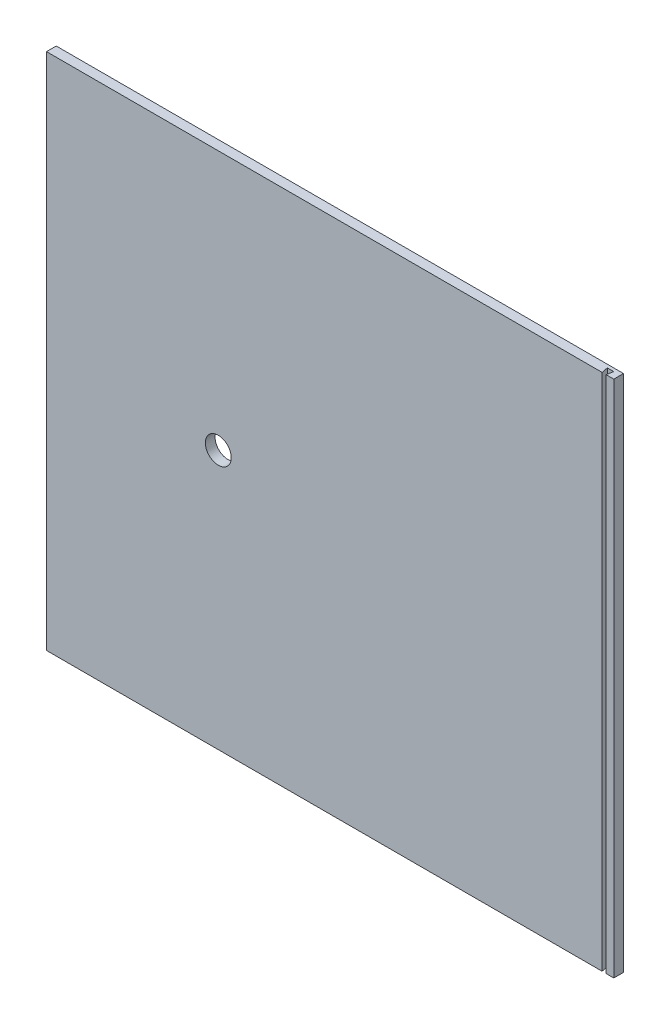
ISO-10303-21;
HEADER;
FILE_DESCRIPTION(('STEP AP214'),'2;1');
FILE_NAME('part.step','',(''),(''),'','','');
FILE_SCHEMA(('AUTOMOTIVE_DESIGN { 1 0 10303 214 1 1 1 1 }'));
ENDSEC;
DATA;
#1=APPLICATION_CONTEXT('core data for automotive mechanical design processes');
#2=APPLICATION_PROTOCOL_DEFINITION('international standard','automotive_design',2000,#1);
#3=PRODUCT_CONTEXT('',#1,'mechanical');
#4=PRODUCT('Part','Part','',(#3));
#5=PRODUCT_RELATED_PRODUCT_CATEGORY('part','',(#4));
#6=PRODUCT_DEFINITION_FORMATION('','',#4);
#7=PRODUCT_DEFINITION_CONTEXT('part definition',#1,'design');
#8=PRODUCT_DEFINITION('design','',#6,#7);
#9=PRODUCT_DEFINITION_SHAPE('','',#8);
#10=(LENGTH_UNIT() NAMED_UNIT(*) SI_UNIT(.MILLI.,.METRE.));
#11=(NAMED_UNIT(*) PLANE_ANGLE_UNIT() SI_UNIT($,.RADIAN.));
#12=(NAMED_UNIT(*) SI_UNIT($,.STERADIAN.) SOLID_ANGLE_UNIT());
#13=UNCERTAINTY_MEASURE_WITH_UNIT(LENGTH_MEASURE(1.E-05),#10,'distance_accuracy_value','');
#14=(GEOMETRIC_REPRESENTATION_CONTEXT(3) GLOBAL_UNCERTAINTY_ASSIGNED_CONTEXT((#13)) GLOBAL_UNIT_ASSIGNED_CONTEXT((#10,
#11,#12)) REPRESENTATION_CONTEXT('',''));
#15=CARTESIAN_POINT('',(0.,0.,0.));
#16=DIRECTION('',(0.,0.,1.));
#17=DIRECTION('',(1.,0.,0.));
#18=AXIS2_PLACEMENT_3D('',#15,#16,#17);
#19=CARTESIAN_POINT('',(0.,0.,1.5));
#20=DIRECTION('',(0.,0.,-1.));
#21=DIRECTION('',(-1.,0.,0.));
#22=AXIS2_PLACEMENT_3D('',#19,#20,#21);
#23=PLANE('',#22);
#24=DIRECTION('',(0.,1.,0.));
#25=VECTOR('',#24,1.);
#26=CARTESIAN_POINT('',(86.2999999999999,-1.41925199609233,1.5));
#27=LINE('',#26,#25);
#28=CARTESIAN_POINT('',(86.3,0.,1.5));
#29=VERTEX_POINT('',#28);
#30=CARTESIAN_POINT('',(86.3,80.,1.5));
#31=VERTEX_POINT('',#30);
#32=EDGE_CURVE('E124',#29,#31,#27,.T.);
#33=ORIENTED_EDGE('',*,*,#32,.F.);
#34=DIRECTION('',(1.,0.,0.));
#35=VECTOR('',#34,1.);
#36=CARTESIAN_POINT('',(0.,0.,1.5));
#37=LINE('',#36,#35);
#38=CARTESIAN_POINT('',(87.5,0.,1.5));
#39=VERTEX_POINT('',#38);
#40=EDGE_CURVE('E142',#29,#39,#37,.T.);
#41=ORIENTED_EDGE('',*,*,#40,.T.);
#42=DIRECTION('',(0.,1.,0.));
#43=VECTOR('',#42,1.);
#44=CARTESIAN_POINT('',(87.5,0.,1.5));
#45=LINE('',#44,#43);
#46=CARTESIAN_POINT('',(87.5,80.,1.5));
#47=VERTEX_POINT('',#46);
#48=EDGE_CURVE('E144',#39,#47,#45,.T.);
#49=ORIENTED_EDGE('',*,*,#48,.T.);
#50=DIRECTION('',(-1.,0.,0.));
#51=VECTOR('',#50,1.);
#52=CARTESIAN_POINT('',(0.,80.,1.5));
#53=LINE('',#52,#51);
#54=EDGE_CURVE('E146',#47,#31,#53,.T.);
#55=ORIENTED_EDGE('',*,*,#54,.T.);
#56=EDGE_LOOP('',(#33,#41,#49,#55));
#57=FACE_BOUND('',#56,.T.);
#58=ADVANCED_FACE('F33',(#57),#23,.F.);
#59=CARTESIAN_POINT('',(0.,0.,1.5));
#60=DIRECTION('',(1.,0.,0.));
#61=DIRECTION('',(0.,0.,-1.));
#62=AXIS2_PLACEMENT_3D('',#59,#60,#61);
#63=PLANE('',#62);
#64=DIRECTION('',(0.,-1.,0.));
#65=VECTOR('',#64,1.);
#66=CARTESIAN_POINT('',(0.,0.,0.));
#67=LINE('',#66,#65);
#68=CARTESIAN_POINT('',(0.,80.,0.));
#69=VERTEX_POINT('',#68);
#70=CARTESIAN_POINT('',(0.,0.,0.));
#71=VERTEX_POINT('',#70);
#72=EDGE_CURVE('E149',#69,#71,#67,.T.);
#73=ORIENTED_EDGE('',*,*,#72,.T.);
#74=DIRECTION('',(0.,0.,-1.));
#75=VECTOR('',#74,1.);
#76=CARTESIAN_POINT('',(0.,0.,1.5));
#77=LINE('',#76,#75);
#78=CARTESIAN_POINT('',(0.,0.,1.5));
#79=VERTEX_POINT('',#78);
#80=EDGE_CURVE('E11',#79,#71,#77,.T.);
#81=ORIENTED_EDGE('',*,*,#80,.F.);
#82=DIRECTION('',(0.,-1.,0.));
#83=VECTOR('',#82,1.);
#84=CARTESIAN_POINT('',(0.,0.,1.5));
#85=LINE('',#84,#83);
#86=CARTESIAN_POINT('',(0.,80.,1.5));
#87=VERTEX_POINT('',#86);
#88=EDGE_CURVE('E140',#87,#79,#85,.T.);
#89=ORIENTED_EDGE('',*,*,#88,.F.);
#90=DIRECTION('',(0.,0.,-1.));
#91=VECTOR('',#90,1.);
#92=CARTESIAN_POINT('',(0.,80.,1.5));
#93=LINE('',#92,#91);
#94=EDGE_CURVE('E148',#87,#69,#93,.T.);
#95=ORIENTED_EDGE('',*,*,#94,.T.);
#96=EDGE_LOOP('',(#73,#81,#89,#95));
#97=FACE_BOUND('',#96,.T.);
#98=ADVANCED_FACE('F35',(#97),#63,.F.);
#99=CARTESIAN_POINT('',(0.,0.,1.5));
#100=DIRECTION('',(0.,1.,0.));
#101=DIRECTION('',(0.,0.,1.));
#102=AXIS2_PLACEMENT_3D('',#99,#100,#101);
#103=PLANE('',#102);
#104=DIRECTION('',(-1.,0.,0.));
#105=VECTOR('',#104,1.);
#106=CARTESIAN_POINT('',(0.,0.,0.492887181884782));
#107=LINE('',#106,#105);
#108=CARTESIAN_POINT('',(86.5,0.,0.492887181884782));
#109=VERTEX_POINT('',#108);
#110=CARTESIAN_POINT('',(85.5,0.,0.492887181884779));
#111=VERTEX_POINT('',#110);
#112=EDGE_CURVE('E117',#109,#111,#107,.T.);
#113=ORIENTED_EDGE('',*,*,#112,.T.);
#114=DIRECTION('',(-0.194783779543401,0.,-0.98084620569526));
#115=VECTOR('',#114,1.);
#116=CARTESIAN_POINT('',(82.1619008330915,0.,-16.3163251137782));
#117=LINE('',#116,#115);
#118=CARTESIAN_POINT('',(85.7,0.,1.5));
#119=VERTEX_POINT('',#118);
#120=EDGE_CURVE('E139',#119,#111,#117,.T.);
#121=ORIENTED_EDGE('',*,*,#120,.F.);
#122=EDGE_CURVE('E86',#79,#119,#37,.T.);
#123=ORIENTED_EDGE('',*,*,#122,.F.);
#124=ORIENTED_EDGE('',*,*,#80,.T.);
#125=DIRECTION('',(1.,0.,0.));
#126=VECTOR('',#125,1.);
#127=CARTESIAN_POINT('',(0.,0.,0.));
#128=LINE('',#127,#126);
#129=CARTESIAN_POINT('',(87.5,0.,0.));
#130=VERTEX_POINT('',#129);
#131=EDGE_CURVE('E152',#71,#130,#128,.T.);
#132=ORIENTED_EDGE('',*,*,#131,.T.);
#133=DIRECTION('',(0.,0.,-1.));
#134=VECTOR('',#133,1.);
#135=CARTESIAN_POINT('',(87.5,0.,1.5));
#136=LINE('',#135,#134);
#137=EDGE_CURVE('E41',#39,#130,#136,.T.);
#138=ORIENTED_EDGE('',*,*,#137,.F.);
#139=ORIENTED_EDGE('',*,*,#40,.F.);
#140=DIRECTION('',(0.194783779543401,0.,-0.98084620569526));
#141=VECTOR('',#140,1.);
#142=CARTESIAN_POINT('',(83.3122951939159,0.,16.5447790347555));
#143=LINE('',#142,#141);
#144=EDGE_CURVE('E48',#29,#109,#143,.T.);
#145=ORIENTED_EDGE('',*,*,#144,.T.);
#146=EDGE_LOOP('',(#113,#121,#123,#124,#132,#138,#139,#145));
#147=FACE_BOUND('',#146,.T.);
#148=ADVANCED_FACE('F176',(#147),#103,.F.);
#149=CARTESIAN_POINT('',(87.5,0.,1.5));
#150=DIRECTION('',(-1.,0.,0.));
#151=DIRECTION('',(0.,0.,1.));
#152=AXIS2_PLACEMENT_3D('',#149,#150,#151);
#153=PLANE('',#152);
#154=DIRECTION('',(0.,1.,0.));
#155=VECTOR('',#154,1.);
#156=CARTESIAN_POINT('',(87.5,0.,0.));
#157=LINE('',#156,#155);
#158=CARTESIAN_POINT('',(87.5,80.,0.));
#159=VERTEX_POINT('',#158);
#160=EDGE_CURVE('E154',#130,#159,#157,.T.);
#161=ORIENTED_EDGE('',*,*,#160,.T.);
#162=DIRECTION('',(0.,0.,-1.));
#163=VECTOR('',#162,1.);
#164=CARTESIAN_POINT('',(87.5,80.,1.5));
#165=LINE('',#164,#163);
#166=EDGE_CURVE('E158',#47,#159,#165,.T.);
#167=ORIENTED_EDGE('',*,*,#166,.F.);
#168=ORIENTED_EDGE('',*,*,#48,.F.);
#169=ORIENTED_EDGE('',*,*,#137,.T.);
#170=EDGE_LOOP('',(#161,#167,#168,#169));
#171=FACE_BOUND('',#170,.T.);
#172=ADVANCED_FACE('F164',(#171),#153,.F.);
#173=CARTESIAN_POINT('',(0.,80.,1.5));
#174=DIRECTION('',(0.,-1.,0.));
#175=DIRECTION('',(1.,0.,0.));
#176=AXIS2_PLACEMENT_3D('',#173,#174,#175);
#177=PLANE('',#176);
#178=CARTESIAN_POINT('',(85.7,80.,1.5));
#179=VERTEX_POINT('',#178);
#180=EDGE_CURVE('E57',#179,#87,#53,.T.);
#181=ORIENTED_EDGE('',*,*,#180,.F.);
#182=DIRECTION('',(0.194783779543401,0.,0.98084620569526));
#183=VECTOR('',#182,1.);
#184=CARTESIAN_POINT('',(82.1619008330915,80.,-16.3163251137782));
#185=LINE('',#184,#183);
#186=CARTESIAN_POINT('',(85.5,80.,0.492887181884779));
#187=VERTEX_POINT('',#186);
#188=EDGE_CURVE('E119',#187,#179,#185,.T.);
#189=ORIENTED_EDGE('',*,*,#188,.F.);
#190=DIRECTION('',(1.,0.,0.));
#191=VECTOR('',#190,1.);
#192=CARTESIAN_POINT('',(0.,80.,0.492887181884782));
#193=LINE('',#192,#191);
#194=CARTESIAN_POINT('',(86.5,80.,0.492887181884782));
#195=VERTEX_POINT('',#194);
#196=EDGE_CURVE('E114',#187,#195,#193,.T.);
#197=ORIENTED_EDGE('',*,*,#196,.T.);
#198=DIRECTION('',(-0.194783779543401,0.,0.98084620569526));
#199=VECTOR('',#198,1.);
#200=CARTESIAN_POINT('',(83.312295193916,80.,16.5447790347555));
#201=LINE('',#200,#199);
#202=EDGE_CURVE('E122',#195,#31,#201,.T.);
#203=ORIENTED_EDGE('',*,*,#202,.T.);
#204=ORIENTED_EDGE('',*,*,#54,.F.);
#205=ORIENTED_EDGE('',*,*,#166,.T.);
#206=DIRECTION('',(-1.,0.,0.));
#207=VECTOR('',#206,1.);
#208=CARTESIAN_POINT('',(0.,80.,0.));
#209=LINE('',#208,#207);
#210=EDGE_CURVE('E79',#159,#69,#209,.T.);
#211=ORIENTED_EDGE('',*,*,#210,.T.);
#212=ORIENTED_EDGE('',*,*,#94,.F.);
#213=EDGE_LOOP('',(#181,#189,#197,#203,#204,#205,#211,#212));
#214=FACE_BOUND('',#213,.T.);
#215=ADVANCED_FACE('F129',(#214),#177,.F.);
#216=CARTESIAN_POINT('',(26.5,40.,1.5));
#217=DIRECTION('',(0.,0.,-1.));
#218=DIRECTION('',(-1.,0.,0.));
#219=AXIS2_PLACEMENT_3D('',#216,#217,#218);
#220=CIRCLE('',#219,2.00000000000006);
#221=CARTESIAN_POINT('',(24.4999999999999,40.,1.5));
#222=VERTEX_POINT('',#221);
#223=EDGE_CURVE('E127',#222,#222,#220,.F.);
#224=ORIENTED_EDGE('',*,*,#223,.F.);
#225=EDGE_LOOP('',(#224));
#226=FACE_BOUND('',#225,.T.);
#227=ORIENTED_EDGE('',*,*,#122,.T.);
#228=DIRECTION('',(0.,1.,0.));
#229=VECTOR('',#228,1.);
#230=CARTESIAN_POINT('',(85.7,-1.41925199609233,1.5));
#231=LINE('',#230,#229);
#232=EDGE_CURVE('E135',#119,#179,#231,.T.);
#233=ORIENTED_EDGE('',*,*,#232,.T.);
#234=ORIENTED_EDGE('',*,*,#180,.T.);
#235=ORIENTED_EDGE('',*,*,#88,.T.);
#236=EDGE_LOOP('',(#227,#233,#234,#235));
#237=FACE_BOUND('',#236,.T.);
#238=ADVANCED_FACE('F173',(#226,#237),#23,.F.);
#239=CARTESIAN_POINT('',(0.,0.,0.));
#240=DIRECTION('',(0.,0.,-1.));
#241=DIRECTION('',(-1.,0.,0.));
#242=AXIS2_PLACEMENT_3D('',#239,#240,#241);
#243=PLANE('',#242);
#244=CARTESIAN_POINT('',(26.5,40.,0.));
#245=DIRECTION('',(0.,0.,-1.));
#246=DIRECTION('',(-1.,0.,0.));
#247=AXIS2_PLACEMENT_3D('',#244,#245,#246);
#248=CIRCLE('',#247,2.00000000000006);
#249=CARTESIAN_POINT('',(24.4999999999999,40.,0.));
#250=VERTEX_POINT('',#249);
#251=EDGE_CURVE('E181',#250,#250,#248,.T.);
#252=ORIENTED_EDGE('',*,*,#251,.F.);
#253=EDGE_LOOP('',(#252));
#254=FACE_BOUND('',#253,.T.);
#255=ORIENTED_EDGE('',*,*,#72,.F.);
#256=ORIENTED_EDGE('',*,*,#210,.F.);
#257=ORIENTED_EDGE('',*,*,#160,.F.);
#258=ORIENTED_EDGE('',*,*,#131,.F.);
#259=EDGE_LOOP('',(#255,#256,#257,#258));
#260=FACE_BOUND('',#259,.T.);
#261=ADVANCED_FACE('F169',(#254,#260),#243,.T.);
#262=CARTESIAN_POINT('',(0.,-1.41925199609232,0.492887181884782));
#263=DIRECTION('',(0.,0.,1.));
#264=DIRECTION('',(1.,0.,0.));
#265=AXIS2_PLACEMENT_3D('',#262,#263,#264);
#266=PLANE('',#265);
#267=DIRECTION('',(0.,1.,0.));
#268=VECTOR('',#267,1.);
#269=CARTESIAN_POINT('',(86.5,-1.41925199609233,0.492887181884782));
#270=LINE('',#269,#268);
#271=EDGE_CURVE('E109',#109,#195,#270,.T.);
#272=ORIENTED_EDGE('',*,*,#271,.T.);
#273=ORIENTED_EDGE('',*,*,#196,.F.);
#274=DIRECTION('',(0.,1.,0.));
#275=VECTOR('',#274,1.);
#276=CARTESIAN_POINT('',(85.5,-1.41925199609233,0.492887181884779));
#277=LINE('',#276,#275);
#278=EDGE_CURVE('E118',#111,#187,#277,.T.);
#279=ORIENTED_EDGE('',*,*,#278,.F.);
#280=ORIENTED_EDGE('',*,*,#112,.F.);
#281=EDGE_LOOP('',(#272,#273,#279,#280));
#282=FACE_BOUND('',#281,.T.);
#283=ADVANCED_FACE('F111',(#282),#266,.T.);
#284=CARTESIAN_POINT('',(82.1619008330915,-1.41925199609233,-16.3163251137782));
#285=DIRECTION('',(-0.98084620569526,0.,0.194783779543401));
#286=DIRECTION('',(0.194783779543401,0.,0.98084620569526));
#287=AXIS2_PLACEMENT_3D('',#284,#285,#286);
#288=PLANE('',#287);
#289=ORIENTED_EDGE('',*,*,#120,.T.);
#290=ORIENTED_EDGE('',*,*,#278,.T.);
#291=ORIENTED_EDGE('',*,*,#188,.T.);
#292=ORIENTED_EDGE('',*,*,#232,.F.);
#293=EDGE_LOOP('',(#289,#290,#291,#292));
#294=FACE_BOUND('',#293,.T.);
#295=ADVANCED_FACE('F175',(#294),#288,.F.);
#296=CARTESIAN_POINT('',(83.3122951939159,-1.41925199609233,16.5447790347555));
#297=DIRECTION('',(-0.98084620569526,0.,-0.194783779543401));
#298=DIRECTION('',(-0.194783779543401,0.,0.98084620569526));
#299=AXIS2_PLACEMENT_3D('',#296,#297,#298);
#300=PLANE('',#299);
#301=ORIENTED_EDGE('',*,*,#32,.T.);
#302=ORIENTED_EDGE('',*,*,#202,.F.);
#303=ORIENTED_EDGE('',*,*,#271,.F.);
#304=ORIENTED_EDGE('',*,*,#144,.F.);
#305=EDGE_LOOP('',(#301,#302,#303,#304));
#306=FACE_BOUND('',#305,.T.);
#307=ADVANCED_FACE('F123',(#306),#300,.T.);
#308=CARTESIAN_POINT('',(26.5,40.,7.15685424949254));
#309=DIRECTION('',(0.,0.,-1.));
#310=DIRECTION('',(-1.,0.,0.));
#311=AXIS2_PLACEMENT_3D('',#308,#309,#310);
#312=CYLINDRICAL_SURFACE('',#311,2.00000000000006);
#313=ORIENTED_EDGE('',*,*,#223,.T.);
#314=EDGE_LOOP('',(#313));
#315=FACE_BOUND('',#314,.T.);
#316=ORIENTED_EDGE('',*,*,#251,.T.);
#317=EDGE_LOOP('',(#316));
#318=FACE_BOUND('',#317,.T.);
#319=ADVANCED_FACE('F185',(#315,#318),#312,.F.);
#320=CLOSED_SHELL('',(#58,#98,#148,#172,#215,#238,#261,#283,#295,#307,#319));
#321=MANIFOLD_SOLID_BREP('B2',#320);
#322=ADVANCED_BREP_SHAPE_REPRESENTATION('',(#18,#321),#14);
#323=SHAPE_DEFINITION_REPRESENTATION(#9,#322);
ENDSEC;
END-ISO-10303-21;
